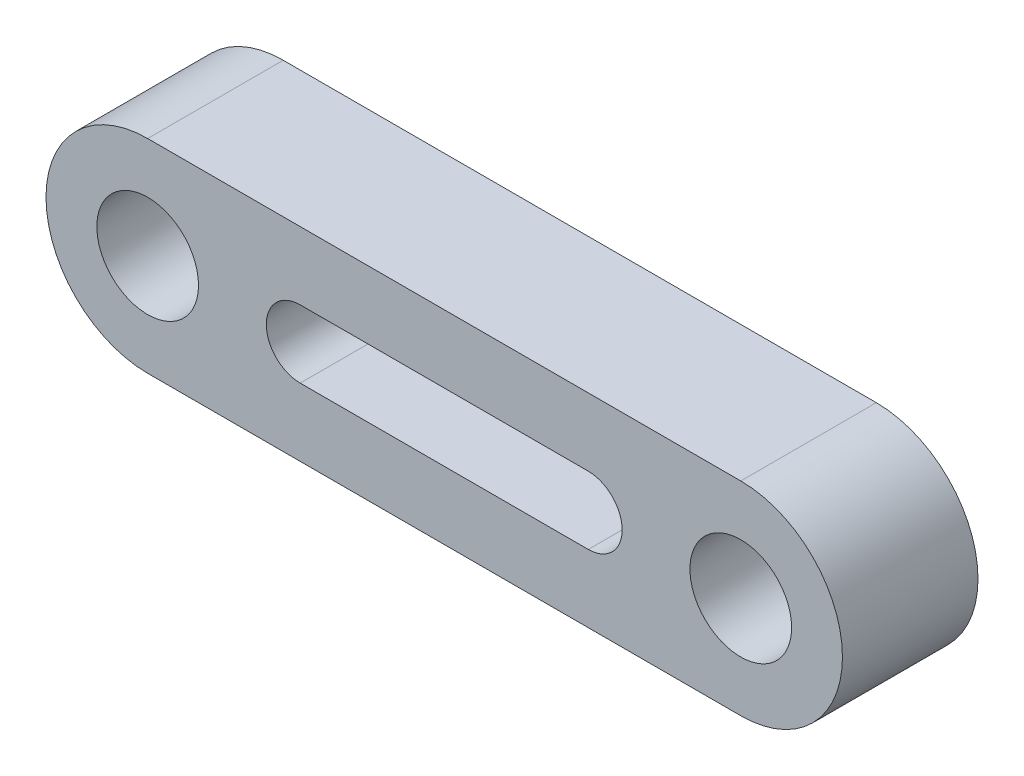
ISO-10303-21;
HEADER;
FILE_DESCRIPTION(('STEP AP214'),'2;1');
FILE_NAME('part.step','',(''),(''),'','','');
FILE_SCHEMA(('AUTOMOTIVE_DESIGN { 1 0 10303 214 1 1 1 1 }'));
ENDSEC;
DATA;
#1=APPLICATION_CONTEXT('core data for automotive mechanical design processes');
#2=APPLICATION_PROTOCOL_DEFINITION('international standard','automotive_design',2000,#1);
#3=PRODUCT_CONTEXT('',#1,'mechanical');
#4=PRODUCT('Part','Part','',(#3));
#5=PRODUCT_RELATED_PRODUCT_CATEGORY('part','',(#4));
#6=PRODUCT_DEFINITION_FORMATION('','',#4);
#7=PRODUCT_DEFINITION_CONTEXT('part definition',#1,'design');
#8=PRODUCT_DEFINITION('design','',#6,#7);
#9=PRODUCT_DEFINITION_SHAPE('','',#8);
#10=(LENGTH_UNIT() NAMED_UNIT(*) SI_UNIT(.MILLI.,.METRE.));
#11=(NAMED_UNIT(*) PLANE_ANGLE_UNIT() SI_UNIT($,.RADIAN.));
#12=(NAMED_UNIT(*) SI_UNIT($,.STERADIAN.) SOLID_ANGLE_UNIT());
#13=UNCERTAINTY_MEASURE_WITH_UNIT(LENGTH_MEASURE(1.E-05),#10,'distance_accuracy_value','');
#14=(GEOMETRIC_REPRESENTATION_CONTEXT(3) GLOBAL_UNCERTAINTY_ASSIGNED_CONTEXT((#13)) GLOBAL_UNIT_ASSIGNED_CONTEXT((#10,
#11,#12)) REPRESENTATION_CONTEXT('',''));
#15=CARTESIAN_POINT('',(0.,0.,0.));
#16=DIRECTION('',(0.,0.,1.));
#17=DIRECTION('',(1.,0.,0.));
#18=AXIS2_PLACEMENT_3D('',#15,#16,#17);
#19=CARTESIAN_POINT('',(0.,0.,4.));
#20=DIRECTION('',(0.,0.,1.));
#21=DIRECTION('',(1.,0.,0.));
#22=AXIS2_PLACEMENT_3D('',#19,#20,#21);
#23=PLANE('',#22);
#24=CARTESIAN_POINT('',(4.5,0.,4.));
#25=DIRECTION('',(0.,0.,1.));
#26=DIRECTION('',(1.,0.,0.));
#27=AXIS2_PLACEMENT_3D('',#24,#25,#26);
#28=CIRCLE('',#27,1.);
#29=CARTESIAN_POINT('',(4.5,1.,4.));
#30=VERTEX_POINT('',#29);
#31=CARTESIAN_POINT('',(4.5,-1.,4.));
#32=VERTEX_POINT('',#31);
#33=EDGE_CURVE('E54',#30,#32,#28,.T.);
#34=ORIENTED_EDGE('',*,*,#33,.F.);
#35=DIRECTION('',(-1.,0.,0.));
#36=VECTOR('',#35,1.);
#37=CARTESIAN_POINT('',(4.5,1.,4.));
#38=LINE('',#37,#36);
#39=CARTESIAN_POINT('',(13.,1.,4.));
#40=VERTEX_POINT('',#39);
#41=EDGE_CURVE('E112',#40,#30,#38,.T.);
#42=ORIENTED_EDGE('',*,*,#41,.F.);
#43=CARTESIAN_POINT('',(13.,0.,4.));
#44=DIRECTION('',(0.,0.,1.));
#45=DIRECTION('',(1.,0.,0.));
#46=AXIS2_PLACEMENT_3D('',#43,#44,#45);
#47=CIRCLE('',#46,1.);
#48=CARTESIAN_POINT('',(13.,-1.,4.));
#49=VERTEX_POINT('',#48);
#50=EDGE_CURVE('E132',#49,#40,#47,.T.);
#51=ORIENTED_EDGE('',*,*,#50,.F.);
#52=DIRECTION('',(1.,0.,0.));
#53=VECTOR('',#52,1.);
#54=CARTESIAN_POINT('',(4.5,-1.,4.));
#55=LINE('',#54,#53);
#56=EDGE_CURVE('E126',#32,#49,#55,.T.);
#57=ORIENTED_EDGE('',*,*,#56,.F.);
#58=EDGE_LOOP('',(#34,#42,#51,#57));
#59=FACE_BOUND('',#58,.T.);
#60=CARTESIAN_POINT('',(0.,0.,4.));
#61=DIRECTION('',(0.,0.,1.));
#62=DIRECTION('',(1.,0.,0.));
#63=AXIS2_PLACEMENT_3D('',#60,#61,#62);
#64=CIRCLE('',#63,1.5);
#65=CARTESIAN_POINT('',(1.5,0.,4.));
#66=VERTEX_POINT('',#65);
#67=EDGE_CURVE('E147',#66,#66,#64,.T.);
#68=ORIENTED_EDGE('',*,*,#67,.F.);
#69=EDGE_LOOP('',(#68));
#70=FACE_BOUND('',#69,.T.);
#71=CARTESIAN_POINT('',(0.,0.,4.));
#72=DIRECTION('',(0.,0.,1.));
#73=DIRECTION('',(1.,0.,0.));
#74=AXIS2_PLACEMENT_3D('',#71,#72,#73);
#75=CIRCLE('',#74,3.);
#76=CARTESIAN_POINT('',(0.,3.,4.));
#77=VERTEX_POINT('',#76);
#78=CARTESIAN_POINT('',(0.,-3.,4.));
#79=VERTEX_POINT('',#78);
#80=EDGE_CURVE('E153',#77,#79,#75,.T.);
#81=ORIENTED_EDGE('',*,*,#80,.T.);
#82=DIRECTION('',(1.,0.,0.));
#83=VECTOR('',#82,1.);
#84=CARTESIAN_POINT('',(0.,-3.,4.));
#85=LINE('',#84,#83);
#86=CARTESIAN_POINT('',(17.5,-3.,4.));
#87=VERTEX_POINT('',#86);
#88=EDGE_CURVE('E156',#79,#87,#85,.T.);
#89=ORIENTED_EDGE('',*,*,#88,.T.);
#90=CARTESIAN_POINT('',(17.5,0.,4.));
#91=DIRECTION('',(0.,0.,1.));
#92=DIRECTION('',(1.,0.,0.));
#93=AXIS2_PLACEMENT_3D('',#90,#91,#92);
#94=CIRCLE('',#93,3.);
#95=CARTESIAN_POINT('',(17.5,3.,4.));
#96=VERTEX_POINT('',#95);
#97=EDGE_CURVE('E159',#87,#96,#94,.T.);
#98=ORIENTED_EDGE('',*,*,#97,.T.);
#99=DIRECTION('',(-1.,0.,0.));
#100=VECTOR('',#99,1.);
#101=CARTESIAN_POINT('',(0.,3.,4.));
#102=LINE('',#101,#100);
#103=EDGE_CURVE('E161',#96,#77,#102,.T.);
#104=ORIENTED_EDGE('',*,*,#103,.T.);
#105=EDGE_LOOP('',(#81,#89,#98,#104));
#106=FACE_BOUND('',#105,.T.);
#107=CARTESIAN_POINT('',(17.5,0.,4.));
#108=DIRECTION('',(0.,0.,1.));
#109=DIRECTION('',(1.,0.,0.));
#110=AXIS2_PLACEMENT_3D('',#107,#108,#109);
#111=CIRCLE('',#110,1.5);
#112=CARTESIAN_POINT('',(19.,0.,4.));
#113=VERTEX_POINT('',#112);
#114=EDGE_CURVE('E141',#113,#113,#111,.T.);
#115=ORIENTED_EDGE('',*,*,#114,.F.);
#116=EDGE_LOOP('',(#115));
#117=FACE_BOUND('',#116,.T.);
#118=ADVANCED_FACE('F39',(#59,#70,#106,#117),#23,.T.);
#119=CARTESIAN_POINT('',(0.,0.,0.));
#120=DIRECTION('',(0.,0.,1.));
#121=DIRECTION('',(1.,0.,0.));
#122=AXIS2_PLACEMENT_3D('',#119,#120,#121);
#123=PLANE('',#122);
#124=DIRECTION('',(1.,0.,0.));
#125=VECTOR('',#124,1.);
#126=CARTESIAN_POINT('',(4.5,1.,0.));
#127=LINE('',#126,#125);
#128=CARTESIAN_POINT('',(4.5,1.,0.));
#129=VERTEX_POINT('',#128);
#130=CARTESIAN_POINT('',(13.,1.,0.));
#131=VERTEX_POINT('',#130);
#132=EDGE_CURVE('E124',#129,#131,#127,.T.);
#133=ORIENTED_EDGE('',*,*,#132,.F.);
#134=CARTESIAN_POINT('',(4.5,0.,0.));
#135=DIRECTION('',(0.,0.,1.));
#136=DIRECTION('',(1.,0.,0.));
#137=AXIS2_PLACEMENT_3D('',#134,#135,#136);
#138=CIRCLE('',#137,1.);
#139=CARTESIAN_POINT('',(4.5,-1.,0.));
#140=VERTEX_POINT('',#139);
#141=EDGE_CURVE('E106',#140,#129,#138,.F.);
#142=ORIENTED_EDGE('',*,*,#141,.F.);
#143=DIRECTION('',(-1.,0.,0.));
#144=VECTOR('',#143,1.);
#145=CARTESIAN_POINT('',(4.5,-1.,0.));
#146=LINE('',#145,#144);
#147=CARTESIAN_POINT('',(13.,-1.,0.));
#148=VERTEX_POINT('',#147);
#149=EDGE_CURVE('E115',#148,#140,#146,.T.);
#150=ORIENTED_EDGE('',*,*,#149,.F.);
#151=CARTESIAN_POINT('',(13.,0.,0.));
#152=DIRECTION('',(0.,0.,1.));
#153=DIRECTION('',(1.,0.,0.));
#154=AXIS2_PLACEMENT_3D('',#151,#152,#153);
#155=CIRCLE('',#154,1.);
#156=EDGE_CURVE('E62',#131,#148,#155,.F.);
#157=ORIENTED_EDGE('',*,*,#156,.F.);
#158=EDGE_LOOP('',(#133,#142,#150,#157));
#159=FACE_BOUND('',#158,.T.);
#160=CARTESIAN_POINT('',(0.,0.,0.));
#161=DIRECTION('',(0.,0.,1.));
#162=DIRECTION('',(1.,0.,0.));
#163=AXIS2_PLACEMENT_3D('',#160,#161,#162);
#164=CIRCLE('',#163,3.);
#165=CARTESIAN_POINT('',(0.,3.,0.));
#166=VERTEX_POINT('',#165);
#167=CARTESIAN_POINT('',(0.,-3.,0.));
#168=VERTEX_POINT('',#167);
#169=EDGE_CURVE('E150',#166,#168,#164,.T.);
#170=ORIENTED_EDGE('',*,*,#169,.F.);
#171=DIRECTION('',(-1.,0.,0.));
#172=VECTOR('',#171,1.);
#173=CARTESIAN_POINT('',(0.,3.,0.));
#174=LINE('',#173,#172);
#175=CARTESIAN_POINT('',(17.5,3.,0.));
#176=VERTEX_POINT('',#175);
#177=EDGE_CURVE('E157',#176,#166,#174,.T.);
#178=ORIENTED_EDGE('',*,*,#177,.F.);
#179=CARTESIAN_POINT('',(17.5,0.,0.));
#180=DIRECTION('',(0.,0.,1.));
#181=DIRECTION('',(1.,0.,0.));
#182=AXIS2_PLACEMENT_3D('',#179,#180,#181);
#183=CIRCLE('',#182,3.);
#184=CARTESIAN_POINT('',(17.5,-3.,0.));
#185=VERTEX_POINT('',#184);
#186=EDGE_CURVE('E168',#185,#176,#183,.T.);
#187=ORIENTED_EDGE('',*,*,#186,.F.);
#188=DIRECTION('',(1.,0.,0.));
#189=VECTOR('',#188,1.);
#190=CARTESIAN_POINT('',(0.,-3.,0.));
#191=LINE('',#190,#189);
#192=EDGE_CURVE('E166',#168,#185,#191,.T.);
#193=ORIENTED_EDGE('',*,*,#192,.F.);
#194=EDGE_LOOP('',(#170,#178,#187,#193));
#195=FACE_BOUND('',#194,.T.);
#196=CARTESIAN_POINT('',(0.,0.,0.));
#197=DIRECTION('',(0.,0.,1.));
#198=DIRECTION('',(1.,0.,0.));
#199=AXIS2_PLACEMENT_3D('',#196,#197,#198);
#200=CIRCLE('',#199,1.5);
#201=CARTESIAN_POINT('',(1.5,0.,0.));
#202=VERTEX_POINT('',#201);
#203=EDGE_CURVE('E144',#202,#202,#200,.T.);
#204=ORIENTED_EDGE('',*,*,#203,.T.);
#205=EDGE_LOOP('',(#204));
#206=FACE_BOUND('',#205,.T.);
#207=CARTESIAN_POINT('',(17.5,0.,0.));
#208=DIRECTION('',(0.,0.,1.));
#209=DIRECTION('',(1.,0.,0.));
#210=AXIS2_PLACEMENT_3D('',#207,#208,#209);
#211=CIRCLE('',#210,1.5);
#212=CARTESIAN_POINT('',(19.,0.,0.));
#213=VERTEX_POINT('',#212);
#214=EDGE_CURVE('E118',#213,#213,#211,.T.);
#215=ORIENTED_EDGE('',*,*,#214,.T.);
#216=EDGE_LOOP('',(#215));
#217=FACE_BOUND('',#216,.T.);
#218=ADVANCED_FACE('F121',(#159,#195,#206,#217),#123,.F.);
#219=CARTESIAN_POINT('',(0.,0.,4.));
#220=DIRECTION('',(0.,0.,-1.));
#221=DIRECTION('',(-1.,0.,0.));
#222=AXIS2_PLACEMENT_3D('',#219,#220,#221);
#223=CYLINDRICAL_SURFACE('',#222,3.);
#224=ORIENTED_EDGE('',*,*,#169,.T.);
#225=DIRECTION('',(0.,0.,-1.));
#226=VECTOR('',#225,1.);
#227=CARTESIAN_POINT('',(0.,-3.,4.));
#228=LINE('',#227,#226);
#229=EDGE_CURVE('E11',#79,#168,#228,.T.);
#230=ORIENTED_EDGE('',*,*,#229,.F.);
#231=ORIENTED_EDGE('',*,*,#80,.F.);
#232=DIRECTION('',(0.,0.,-1.));
#233=VECTOR('',#232,1.);
#234=CARTESIAN_POINT('',(0.,3.,4.));
#235=LINE('',#234,#233);
#236=EDGE_CURVE('E163',#77,#166,#235,.T.);
#237=ORIENTED_EDGE('',*,*,#236,.T.);
#238=EDGE_LOOP('',(#224,#230,#231,#237));
#239=FACE_BOUND('',#238,.T.);
#240=ADVANCED_FACE('F41',(#239),#223,.T.);
#241=CARTESIAN_POINT('',(0.,-3.,4.));
#242=DIRECTION('',(0.,1.,0.));
#243=DIRECTION('',(0.,0.,1.));
#244=AXIS2_PLACEMENT_3D('',#241,#242,#243);
#245=PLANE('',#244);
#246=ORIENTED_EDGE('',*,*,#192,.T.);
#247=DIRECTION('',(0.,0.,-1.));
#248=VECTOR('',#247,1.);
#249=CARTESIAN_POINT('',(17.5,-3.,4.));
#250=LINE('',#249,#248);
#251=EDGE_CURVE('E47',#87,#185,#250,.T.);
#252=ORIENTED_EDGE('',*,*,#251,.F.);
#253=ORIENTED_EDGE('',*,*,#88,.F.);
#254=ORIENTED_EDGE('',*,*,#229,.T.);
#255=EDGE_LOOP('',(#246,#252,#253,#254));
#256=FACE_BOUND('',#255,.T.);
#257=ADVANCED_FACE('F195',(#256),#245,.F.);
#258=CARTESIAN_POINT('',(17.5,0.,4.));
#259=DIRECTION('',(0.,0.,-1.));
#260=DIRECTION('',(-1.,0.,0.));
#261=AXIS2_PLACEMENT_3D('',#258,#259,#260);
#262=CYLINDRICAL_SURFACE('',#261,3.);
#263=ORIENTED_EDGE('',*,*,#186,.T.);
#264=DIRECTION('',(0.,0.,-1.));
#265=VECTOR('',#264,1.);
#266=CARTESIAN_POINT('',(17.5,3.,4.));
#267=LINE('',#266,#265);
#268=EDGE_CURVE('E173',#96,#176,#267,.T.);
#269=ORIENTED_EDGE('',*,*,#268,.F.);
#270=ORIENTED_EDGE('',*,*,#97,.F.);
#271=ORIENTED_EDGE('',*,*,#251,.T.);
#272=EDGE_LOOP('',(#263,#269,#270,#271));
#273=FACE_BOUND('',#272,.T.);
#274=ADVANCED_FACE('F180',(#273),#262,.T.);
#275=CARTESIAN_POINT('',(0.,3.,4.));
#276=DIRECTION('',(0.,-1.,0.));
#277=DIRECTION('',(0.,0.,-1.));
#278=AXIS2_PLACEMENT_3D('',#275,#276,#277);
#279=PLANE('',#278);
#280=ORIENTED_EDGE('',*,*,#177,.T.);
#281=ORIENTED_EDGE('',*,*,#236,.F.);
#282=ORIENTED_EDGE('',*,*,#103,.F.);
#283=ORIENTED_EDGE('',*,*,#268,.T.);
#284=EDGE_LOOP('',(#280,#281,#282,#283));
#285=FACE_BOUND('',#284,.T.);
#286=ADVANCED_FACE('F188',(#285),#279,.F.);
#287=CARTESIAN_POINT('',(0.,0.,4.));
#288=DIRECTION('',(0.,0.,-1.));
#289=DIRECTION('',(-1.,0.,0.));
#290=AXIS2_PLACEMENT_3D('',#287,#288,#289);
#291=CYLINDRICAL_SURFACE('',#290,1.5);
#292=ORIENTED_EDGE('',*,*,#67,.T.);
#293=EDGE_LOOP('',(#292));
#294=FACE_BOUND('',#293,.T.);
#295=ORIENTED_EDGE('',*,*,#203,.F.);
#296=EDGE_LOOP('',(#295));
#297=FACE_BOUND('',#296,.T.);
#298=ADVANCED_FACE('F212',(#294,#297),#291,.F.);
#299=CARTESIAN_POINT('',(17.5,0.,4.));
#300=DIRECTION('',(0.,0.,-1.));
#301=DIRECTION('',(-1.,0.,0.));
#302=AXIS2_PLACEMENT_3D('',#299,#300,#301);
#303=CYLINDRICAL_SURFACE('',#302,1.5);
#304=ORIENTED_EDGE('',*,*,#114,.T.);
#305=EDGE_LOOP('',(#304));
#306=FACE_BOUND('',#305,.T.);
#307=ORIENTED_EDGE('',*,*,#214,.F.);
#308=EDGE_LOOP('',(#307));
#309=FACE_BOUND('',#308,.T.);
#310=ADVANCED_FACE('F219',(#306,#309),#303,.F.);
#311=CARTESIAN_POINT('',(4.5,0.,-0.00100000000000013));
#312=DIRECTION('',(0.,0.,1.));
#313=DIRECTION('',(1.,0.,0.));
#314=AXIS2_PLACEMENT_3D('',#311,#312,#313);
#315=CYLINDRICAL_SURFACE('',#314,1.);
#316=ORIENTED_EDGE('',*,*,#141,.T.);
#317=DIRECTION('',(0.,0.,1.));
#318=VECTOR('',#317,1.);
#319=CARTESIAN_POINT('',(4.5,1.,-0.00100000000000013));
#320=LINE('',#319,#318);
#321=EDGE_CURVE('E119',#129,#30,#320,.T.);
#322=ORIENTED_EDGE('',*,*,#321,.T.);
#323=ORIENTED_EDGE('',*,*,#33,.T.);
#324=DIRECTION('',(0.,0.,1.));
#325=VECTOR('',#324,1.);
#326=CARTESIAN_POINT('',(4.5,-1.,-0.00100000000000013));
#327=LINE('',#326,#325);
#328=EDGE_CURVE('E102',#140,#32,#327,.T.);
#329=ORIENTED_EDGE('',*,*,#328,.F.);
#330=EDGE_LOOP('',(#316,#322,#323,#329));
#331=FACE_BOUND('',#330,.T.);
#332=ADVANCED_FACE('F104',(#331),#315,.F.);
#333=CARTESIAN_POINT('',(4.5,1.,-0.00100000000000013));
#334=DIRECTION('',(0.,1.,0.));
#335=DIRECTION('',(0.,0.,1.));
#336=AXIS2_PLACEMENT_3D('',#333,#334,#335);
#337=PLANE('',#336);
#338=ORIENTED_EDGE('',*,*,#132,.T.);
#339=DIRECTION('',(0.,0.,1.));
#340=VECTOR('',#339,1.);
#341=CARTESIAN_POINT('',(13.,1.,-0.00100000000000013));
#342=LINE('',#341,#340);
#343=EDGE_CURVE('E138',#131,#40,#342,.T.);
#344=ORIENTED_EDGE('',*,*,#343,.T.);
#345=ORIENTED_EDGE('',*,*,#41,.T.);
#346=ORIENTED_EDGE('',*,*,#321,.F.);
#347=EDGE_LOOP('',(#338,#344,#345,#346));
#348=FACE_BOUND('',#347,.T.);
#349=ADVANCED_FACE('F233',(#348),#337,.F.);
#350=CARTESIAN_POINT('',(13.,0.,-0.00100000000000013));
#351=DIRECTION('',(0.,0.,1.));
#352=DIRECTION('',(1.,0.,0.));
#353=AXIS2_PLACEMENT_3D('',#350,#351,#352);
#354=CYLINDRICAL_SURFACE('',#353,1.);
#355=ORIENTED_EDGE('',*,*,#156,.T.);
#356=DIRECTION('',(0.,0.,1.));
#357=VECTOR('',#356,1.);
#358=CARTESIAN_POINT('',(13.,-1.,-0.00100000000000013));
#359=LINE('',#358,#357);
#360=EDGE_CURVE('E111',#148,#49,#359,.T.);
#361=ORIENTED_EDGE('',*,*,#360,.T.);
#362=ORIENTED_EDGE('',*,*,#50,.T.);
#363=ORIENTED_EDGE('',*,*,#343,.F.);
#364=EDGE_LOOP('',(#355,#361,#362,#363));
#365=FACE_BOUND('',#364,.T.);
#366=ADVANCED_FACE('F238',(#365),#354,.F.);
#367=CARTESIAN_POINT('',(4.5,-1.,-0.00100000000000013));
#368=DIRECTION('',(0.,-1.,0.));
#369=DIRECTION('',(0.,0.,-1.));
#370=AXIS2_PLACEMENT_3D('',#367,#368,#369);
#371=PLANE('',#370);
#372=ORIENTED_EDGE('',*,*,#149,.T.);
#373=ORIENTED_EDGE('',*,*,#328,.T.);
#374=ORIENTED_EDGE('',*,*,#56,.T.);
#375=ORIENTED_EDGE('',*,*,#360,.F.);
#376=EDGE_LOOP('',(#372,#373,#374,#375));
#377=FACE_BOUND('',#376,.T.);
#378=ADVANCED_FACE('F116',(#377),#371,.F.);
#379=CLOSED_SHELL('',(#118,#218,#240,#257,#274,#286,#298,#310,#332,#349,#366,#378));
#380=MANIFOLD_SOLID_BREP('B2',#379);
#381=ADVANCED_BREP_SHAPE_REPRESENTATION('',(#18,#380),#14);
#382=SHAPE_DEFINITION_REPRESENTATION(#9,#381);
ENDSEC;
END-ISO-10303-21;
